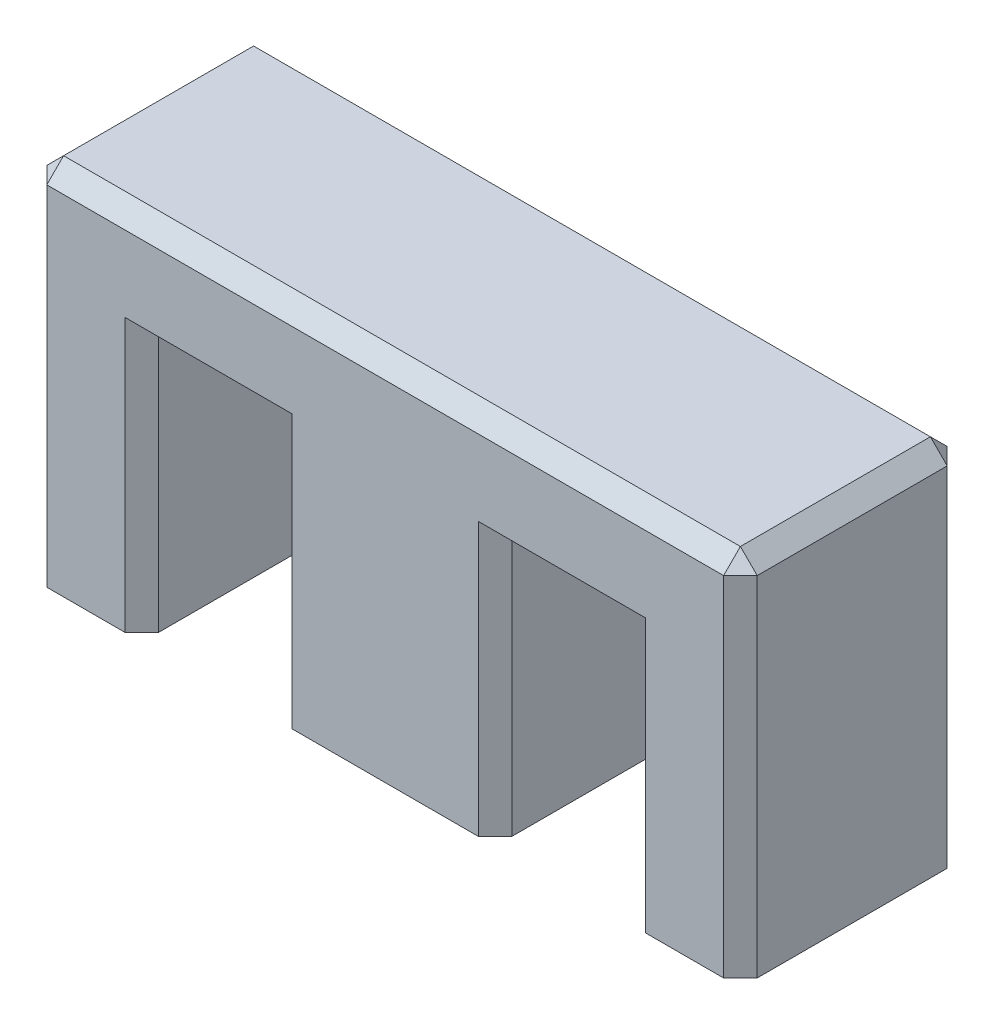
ISO-10303-21;
HEADER;
FILE_DESCRIPTION(('STEP AP214'),'2;1');
FILE_NAME('part.step','',(''),(''),'','','');
FILE_SCHEMA(('AUTOMOTIVE_DESIGN { 1 0 10303 214 1 1 1 1 }'));
ENDSEC;
DATA;
#1=APPLICATION_CONTEXT('core data for automotive mechanical design processes');
#2=APPLICATION_PROTOCOL_DEFINITION('international standard','automotive_design',2000,#1);
#3=PRODUCT_CONTEXT('',#1,'mechanical');
#4=PRODUCT('Part','Part','',(#3));
#5=PRODUCT_RELATED_PRODUCT_CATEGORY('part','',(#4));
#6=PRODUCT_DEFINITION_FORMATION('','',#4);
#7=PRODUCT_DEFINITION_CONTEXT('part definition',#1,'design');
#8=PRODUCT_DEFINITION('design','',#6,#7);
#9=PRODUCT_DEFINITION_SHAPE('','',#8);
#10=(LENGTH_UNIT() NAMED_UNIT(*) SI_UNIT(.MILLI.,.METRE.));
#11=(NAMED_UNIT(*) PLANE_ANGLE_UNIT() SI_UNIT($,.RADIAN.));
#12=(NAMED_UNIT(*) SI_UNIT($,.STERADIAN.) SOLID_ANGLE_UNIT());
#13=UNCERTAINTY_MEASURE_WITH_UNIT(LENGTH_MEASURE(1.E-05),#10,'distance_accuracy_value','');
#14=(GEOMETRIC_REPRESENTATION_CONTEXT(3) GLOBAL_UNCERTAINTY_ASSIGNED_CONTEXT((#13)) GLOBAL_UNIT_ASSIGNED_CONTEXT((#10,
#11,#12)) REPRESENTATION_CONTEXT('',''));
#15=CARTESIAN_POINT('',(0.,0.,0.));
#16=DIRECTION('',(0.,0.,1.));
#17=DIRECTION('',(1.,0.,0.));
#18=AXIS2_PLACEMENT_3D('',#15,#16,#17);
#19=CARTESIAN_POINT('',(28.95,18.0235294117647,13.3));
#20=DIRECTION('',(0.,1.,0.));
#21=DIRECTION('',(-1.,0.,0.));
#22=AXIS2_PLACEMENT_3D('',#19,#20,#21);
#23=PLANE('',#22);
#24=DIRECTION('',(0.,0.,-1.));
#25=VECTOR('',#24,1.);
#26=CARTESIAN_POINT('',(13.075,18.0235294117647,13.3));
#27=LINE('',#26,#25);
#28=CARTESIAN_POINT('',(13.075,18.0235294117647,11.3));
#29=VERTEX_POINT('',#28);
#30=CARTESIAN_POINT('',(13.075,18.0235294117647,-11.3));
#31=VERTEX_POINT('',#30);
#32=EDGE_CURVE('E412',#29,#31,#27,.T.);
#33=ORIENTED_EDGE('',*,*,#32,.T.);
#34=DIRECTION('',(1.,0.,0.));
#35=VECTOR('',#34,1.);
#36=CARTESIAN_POINT('',(28.95,18.0235294117647,-11.3));
#37=LINE('',#36,#35);
#38=CARTESIAN_POINT('',(28.95,18.0235294117647,-11.3));
#39=VERTEX_POINT('',#38);
#40=EDGE_CURVE('E336',#31,#39,#37,.T.);
#41=ORIENTED_EDGE('',*,*,#40,.T.);
#42=DIRECTION('',(0.,0.,-1.));
#43=VECTOR('',#42,1.);
#44=CARTESIAN_POINT('',(28.95,18.0235294117647,13.3));
#45=LINE('',#44,#43);
#46=CARTESIAN_POINT('',(28.95,18.0235294117647,11.3));
#47=VERTEX_POINT('',#46);
#48=EDGE_CURVE('E242',#47,#39,#45,.T.);
#49=ORIENTED_EDGE('',*,*,#48,.F.);
#50=DIRECTION('',(-1.,0.,0.));
#51=VECTOR('',#50,1.);
#52=CARTESIAN_POINT('',(13.075,18.0235294117647,11.3));
#53=LINE('',#52,#51);
#54=EDGE_CURVE('E334',#47,#29,#53,.T.);
#55=ORIENTED_EDGE('',*,*,#54,.T.);
#56=EDGE_LOOP('',(#33,#41,#49,#55));
#57=FACE_BOUND('',#56,.T.);
#58=ADVANCED_FACE('F35',(#57),#23,.F.);
#59=CARTESIAN_POINT('',(28.95,-12.4264705882353,13.3));
#60=DIRECTION('',(1.,0.,0.));
#61=DIRECTION('',(0.,0.,-1.));
#62=AXIS2_PLACEMENT_3D('',#59,#60,#61);
#63=PLANE('',#62);
#64=ORIENTED_EDGE('',*,*,#48,.T.);
#65=DIRECTION('',(0.,-1.,0.));
#66=VECTOR('',#65,1.);
#67=CARTESIAN_POINT('',(28.95,-12.4264705882353,-11.3));
#68=LINE('',#67,#66);
#69=CARTESIAN_POINT('',(28.95,-12.4264705882353,-11.3));
#70=VERTEX_POINT('',#69);
#71=EDGE_CURVE('E332',#39,#70,#68,.T.);
#72=ORIENTED_EDGE('',*,*,#71,.T.);
#73=DIRECTION('',(0.,0.,-1.));
#74=VECTOR('',#73,1.);
#75=CARTESIAN_POINT('',(28.95,-12.4264705882353,13.3));
#76=LINE('',#75,#74);
#77=CARTESIAN_POINT('',(28.95,-12.4264705882353,11.3));
#78=VERTEX_POINT('',#77);
#79=EDGE_CURVE('E447',#78,#70,#76,.T.);
#80=ORIENTED_EDGE('',*,*,#79,.F.);
#81=DIRECTION('',(0.,1.,0.));
#82=VECTOR('',#81,1.);
#83=CARTESIAN_POINT('',(28.95,18.0235294117647,11.3));
#84=LINE('',#83,#82);
#85=EDGE_CURVE('E330',#78,#47,#84,.T.);
#86=ORIENTED_EDGE('',*,*,#85,.T.);
#87=EDGE_LOOP('',(#64,#72,#80,#86));
#88=FACE_BOUND('',#87,.T.);
#89=ADVANCED_FACE('F522',(#88),#63,.F.);
#90=CARTESIAN_POINT('',(42.25,-12.4264705882353,13.3));
#91=DIRECTION('',(0.,1.,0.));
#92=DIRECTION('',(0.,0.,1.));
#93=AXIS2_PLACEMENT_3D('',#90,#91,#92);
#94=PLANE('',#93);
#95=DIRECTION('',(0.,0.,-1.));
#96=VECTOR('',#95,1.);
#97=CARTESIAN_POINT('',(42.25,-12.4264705882353,13.3));
#98=LINE('',#97,#96);
#99=CARTESIAN_POINT('',(42.25,-12.4264705882353,11.3));
#100=VERTEX_POINT('',#99);
#101=CARTESIAN_POINT('',(42.25,-12.4264705882353,-11.3));
#102=VERTEX_POINT('',#101);
#103=EDGE_CURVE('E444',#100,#102,#98,.T.);
#104=ORIENTED_EDGE('',*,*,#103,.F.);
#105=DIRECTION('',(-0.707106781186548,0.,0.707106781186548));
#106=VECTOR('',#105,1.);
#107=CARTESIAN_POINT('',(40.25,-12.4264705882353,13.3));
#108=LINE('',#107,#106);
#109=CARTESIAN_POINT('',(40.25,-12.4264705882353,13.3));
#110=VERTEX_POINT('',#109);
#111=EDGE_CURVE('E283',#100,#110,#108,.T.);
#112=ORIENTED_EDGE('',*,*,#111,.T.);
#113=DIRECTION('',(1.,0.,0.));
#114=VECTOR('',#113,1.);
#115=CARTESIAN_POINT('',(42.25,-12.4264705882353,13.3));
#116=LINE('',#115,#114);
#117=CARTESIAN_POINT('',(30.95,-12.4264705882353,13.3));
#118=VERTEX_POINT('',#117);
#119=EDGE_CURVE('E419',#118,#110,#116,.T.);
#120=ORIENTED_EDGE('',*,*,#119,.F.);
#121=DIRECTION('',(-0.707106781186548,0.,-0.707106781186548));
#122=VECTOR('',#121,1.);
#123=CARTESIAN_POINT('',(30.95,-12.4264705882353,13.3));
#124=LINE('',#123,#122);
#125=EDGE_CURVE('E277',#118,#78,#124,.T.);
#126=ORIENTED_EDGE('',*,*,#125,.T.);
#127=ORIENTED_EDGE('',*,*,#79,.T.);
#128=DIRECTION('',(-0.707106781186548,0.,0.707106781186548));
#129=VECTOR('',#128,1.);
#130=CARTESIAN_POINT('',(28.95,-12.4264705882353,-11.3));
#131=LINE('',#130,#129);
#132=CARTESIAN_POINT('',(30.95,-12.4264705882353,-13.3));
#133=VERTEX_POINT('',#132);
#134=EDGE_CURVE('E279',#70,#133,#131,.F.);
#135=ORIENTED_EDGE('',*,*,#134,.T.);
#136=DIRECTION('',(1.,0.,0.));
#137=VECTOR('',#136,1.);
#138=CARTESIAN_POINT('',(42.25,-12.4264705882353,-13.3));
#139=LINE('',#138,#137);
#140=CARTESIAN_POINT('',(40.25,-12.4264705882353,-13.3));
#141=VERTEX_POINT('',#140);
#142=EDGE_CURVE('E370',#133,#141,#139,.T.);
#143=ORIENTED_EDGE('',*,*,#142,.T.);
#144=DIRECTION('',(-0.707106781186548,0.,-0.707106781186548));
#145=VECTOR('',#144,1.);
#146=CARTESIAN_POINT('',(42.25,-12.4264705882353,-11.3));
#147=LINE('',#146,#145);
#148=EDGE_CURVE('E281',#141,#102,#147,.F.);
#149=ORIENTED_EDGE('',*,*,#148,.T.);
#150=EDGE_LOOP('',(#104,#112,#120,#126,#127,#135,#143,#149));
#151=FACE_BOUND('',#150,.T.);
#152=ADVANCED_FACE('F486',(#151),#94,.F.);
#153=CARTESIAN_POINT('',(42.25,31.0235294117647,13.3));
#154=DIRECTION('',(-1.,0.,0.));
#155=DIRECTION('',(0.,0.,1.));
#156=AXIS2_PLACEMENT_3D('',#153,#154,#155);
#157=PLANE('',#156);
#158=DIRECTION('',(0.,0.,1.));
#159=VECTOR('',#158,1.);
#160=CARTESIAN_POINT('',(42.25,29.0235294117647,13.3));
#161=LINE('',#160,#159);
#162=CARTESIAN_POINT('',(42.25,29.0235294117647,-11.3));
#163=VERTEX_POINT('',#162);
#164=CARTESIAN_POINT('',(42.25,29.0235294117647,11.3));
#165=VERTEX_POINT('',#164);
#166=EDGE_CURVE('E218',#163,#165,#161,.T.);
#167=ORIENTED_EDGE('',*,*,#166,.T.);
#168=DIRECTION('',(0.,-1.,0.));
#169=VECTOR('',#168,1.);
#170=CARTESIAN_POINT('',(42.25,-12.4264705882353,11.3));
#171=LINE('',#170,#169);
#172=EDGE_CURVE('E255',#165,#100,#171,.T.);
#173=ORIENTED_EDGE('',*,*,#172,.T.);
#174=ORIENTED_EDGE('',*,*,#103,.T.);
#175=DIRECTION('',(0.,1.,0.));
#176=VECTOR('',#175,1.);
#177=CARTESIAN_POINT('',(42.25,31.0235294117647,-11.3));
#178=LINE('',#177,#176);
#179=EDGE_CURVE('E248',#102,#163,#178,.T.);
#180=ORIENTED_EDGE('',*,*,#179,.T.);
#181=EDGE_LOOP('',(#167,#173,#174,#180));
#182=FACE_BOUND('',#181,.T.);
#183=ADVANCED_FACE('F474',(#182),#157,.F.);
#184=CARTESIAN_POINT('',(42.25,31.0235294117647,13.3));
#185=DIRECTION('',(0.,-1.,0.));
#186=DIRECTION('',(0.,0.,-1.));
#187=AXIS2_PLACEMENT_3D('',#184,#185,#186);
#188=PLANE('',#187);
#189=DIRECTION('',(1.,0.,0.));
#190=VECTOR('',#189,1.);
#191=CARTESIAN_POINT('',(42.25,31.0235294117647,11.3));
#192=LINE('',#191,#190);
#193=CARTESIAN_POINT('',(-40.25,31.0235294117647,11.3));
#194=VERTEX_POINT('',#193);
#195=CARTESIAN_POINT('',(40.25,31.0235294117647,11.3));
#196=VERTEX_POINT('',#195);
#197=EDGE_CURVE('E246',#194,#196,#192,.T.);
#198=ORIENTED_EDGE('',*,*,#197,.T.);
#199=DIRECTION('',(0.,0.,-1.));
#200=VECTOR('',#199,1.);
#201=CARTESIAN_POINT('',(40.25,31.0235294117647,13.3));
#202=LINE('',#201,#200);
#203=CARTESIAN_POINT('',(40.25,31.0235294117647,-11.3));
#204=VERTEX_POINT('',#203);
#205=EDGE_CURVE('E216',#196,#204,#202,.T.);
#206=ORIENTED_EDGE('',*,*,#205,.T.);
#207=DIRECTION('',(-1.,0.,0.));
#208=VECTOR('',#207,1.);
#209=CARTESIAN_POINT('',(42.25,31.0235294117647,-11.3));
#210=LINE('',#209,#208);
#211=CARTESIAN_POINT('',(-40.25,31.0235294117647,-11.3));
#212=VERTEX_POINT('',#211);
#213=EDGE_CURVE('E235',#204,#212,#210,.T.);
#214=ORIENTED_EDGE('',*,*,#213,.T.);
#215=DIRECTION('',(0.,0.,1.));
#216=VECTOR('',#215,1.);
#217=CARTESIAN_POINT('',(-40.25,31.0235294117647,13.3));
#218=LINE('',#217,#216);
#219=EDGE_CURVE('E241',#212,#194,#218,.T.);
#220=ORIENTED_EDGE('',*,*,#219,.T.);
#221=EDGE_LOOP('',(#198,#206,#214,#220));
#222=FACE_BOUND('',#221,.T.);
#223=ADVANCED_FACE('F244',(#222),#188,.F.);
#224=CARTESIAN_POINT('',(-42.25,31.0235294117647,13.3));
#225=DIRECTION('',(1.,0.,0.));
#226=DIRECTION('',(0.,0.,-1.));
#227=AXIS2_PLACEMENT_3D('',#224,#225,#226);
#228=PLANE('',#227);
#229=DIRECTION('',(0.,0.,-1.));
#230=VECTOR('',#229,1.);
#231=CARTESIAN_POINT('',(-42.25,-12.4264705882353,13.3));
#232=LINE('',#231,#230);
#233=CARTESIAN_POINT('',(-42.25,-12.4264705882353,11.3));
#234=VERTEX_POINT('',#233);
#235=CARTESIAN_POINT('',(-42.25,-12.4264705882353,-11.3));
#236=VERTEX_POINT('',#235);
#237=EDGE_CURVE('E441',#234,#236,#232,.T.);
#238=ORIENTED_EDGE('',*,*,#237,.F.);
#239=DIRECTION('',(0.,1.,0.));
#240=VECTOR('',#239,1.);
#241=CARTESIAN_POINT('',(-42.25,31.0235294117647,11.3));
#242=LINE('',#241,#240);
#243=CARTESIAN_POINT('',(-42.25,29.0235294117647,11.3));
#244=VERTEX_POINT('',#243);
#245=EDGE_CURVE('E297',#234,#244,#242,.T.);
#246=ORIENTED_EDGE('',*,*,#245,.T.);
#247=DIRECTION('',(0.,0.,-1.));
#248=VECTOR('',#247,1.);
#249=CARTESIAN_POINT('',(-42.25,29.0235294117647,13.3));
#250=LINE('',#249,#248);
#251=CARTESIAN_POINT('',(-42.25,29.0235294117647,-11.3));
#252=VERTEX_POINT('',#251);
#253=EDGE_CURVE('E295',#244,#252,#250,.T.);
#254=ORIENTED_EDGE('',*,*,#253,.T.);
#255=DIRECTION('',(0.,-1.,0.));
#256=VECTOR('',#255,1.);
#257=CARTESIAN_POINT('',(-42.25,31.0235294117647,-11.3));
#258=LINE('',#257,#256);
#259=EDGE_CURVE('E293',#252,#236,#258,.T.);
#260=ORIENTED_EDGE('',*,*,#259,.T.);
#261=EDGE_LOOP('',(#238,#246,#254,#260));
#262=FACE_BOUND('',#261,.T.);
#263=ADVANCED_FACE('F803',(#262),#228,.F.);
#264=CARTESIAN_POINT('',(-42.25,-12.4264705882353,13.3));
#265=DIRECTION('',(0.,1.,0.));
#266=DIRECTION('',(0.,0.,1.));
#267=AXIS2_PLACEMENT_3D('',#264,#265,#266);
#268=PLANE('',#267);
#269=DIRECTION('',(1.,0.,0.));
#270=VECTOR('',#269,1.);
#271=CARTESIAN_POINT('',(-42.25,-12.4264705882353,13.3));
#272=LINE('',#271,#270);
#273=CARTESIAN_POINT('',(-40.25,-12.4264705882353,13.3));
#274=VERTEX_POINT('',#273);
#275=CARTESIAN_POINT('',(-30.95,-12.4264705882353,13.3));
#276=VERTEX_POINT('',#275);
#277=EDGE_CURVE('E413',#274,#276,#272,.T.);
#278=ORIENTED_EDGE('',*,*,#277,.F.);
#279=DIRECTION('',(-0.707106781186548,0.,-0.707106781186548));
#280=VECTOR('',#279,1.);
#281=CARTESIAN_POINT('',(-40.25,-12.4264705882353,13.3));
#282=LINE('',#281,#280);
#283=EDGE_CURVE('E291',#274,#234,#282,.T.);
#284=ORIENTED_EDGE('',*,*,#283,.T.);
#285=ORIENTED_EDGE('',*,*,#237,.T.);
#286=DIRECTION('',(-0.707106781186548,0.,0.707106781186548));
#287=VECTOR('',#286,1.);
#288=CARTESIAN_POINT('',(-42.25,-12.4264705882353,-11.3));
#289=LINE('',#288,#287);
#290=CARTESIAN_POINT('',(-40.25,-12.4264705882353,-13.3));
#291=VERTEX_POINT('',#290);
#292=EDGE_CURVE('E289',#236,#291,#289,.F.);
#293=ORIENTED_EDGE('',*,*,#292,.T.);
#294=DIRECTION('',(1.,0.,0.));
#295=VECTOR('',#294,1.);
#296=CARTESIAN_POINT('',(-42.25,-12.4264705882353,-13.3));
#297=LINE('',#296,#295);
#298=CARTESIAN_POINT('',(-30.95,-12.4264705882353,-13.3));
#299=VERTEX_POINT('',#298);
#300=EDGE_CURVE('E425',#291,#299,#297,.T.);
#301=ORIENTED_EDGE('',*,*,#300,.T.);
#302=DIRECTION('',(-0.707106781186548,0.,-0.707106781186548));
#303=VECTOR('',#302,1.);
#304=CARTESIAN_POINT('',(-28.95,-12.4264705882353,-11.3));
#305=LINE('',#304,#303);
#306=CARTESIAN_POINT('',(-28.95,-12.4264705882353,-11.3));
#307=VERTEX_POINT('',#306);
#308=EDGE_CURVE('E287',#299,#307,#305,.F.);
#309=ORIENTED_EDGE('',*,*,#308,.T.);
#310=DIRECTION('',(0.,0.,-1.));
#311=VECTOR('',#310,1.);
#312=CARTESIAN_POINT('',(-28.95,-12.4264705882353,13.3));
#313=LINE('',#312,#311);
#314=CARTESIAN_POINT('',(-28.95,-12.4264705882353,11.3));
#315=VERTEX_POINT('',#314);
#316=EDGE_CURVE('E438',#315,#307,#313,.T.);
#317=ORIENTED_EDGE('',*,*,#316,.F.);
#318=DIRECTION('',(-0.707106781186548,0.,0.707106781186548));
#319=VECTOR('',#318,1.);
#320=CARTESIAN_POINT('',(-30.95,-12.4264705882353,13.3));
#321=LINE('',#320,#319);
#322=EDGE_CURVE('E285',#315,#276,#321,.T.);
#323=ORIENTED_EDGE('',*,*,#322,.T.);
#324=EDGE_LOOP('',(#278,#284,#285,#293,#301,#309,#317,#323));
#325=FACE_BOUND('',#324,.T.);
#326=ADVANCED_FACE('F795',(#325),#268,.F.);
#327=CARTESIAN_POINT('',(-28.95,-12.4264705882353,13.3));
#328=DIRECTION('',(-1.,0.,0.));
#329=DIRECTION('',(0.,0.,1.));
#330=AXIS2_PLACEMENT_3D('',#327,#328,#329);
#331=PLANE('',#330);
#332=ORIENTED_EDGE('',*,*,#316,.T.);
#333=DIRECTION('',(0.,1.,0.));
#334=VECTOR('',#333,1.);
#335=CARTESIAN_POINT('',(-28.95,-12.4264705882353,-11.3));
#336=LINE('',#335,#334);
#337=CARTESIAN_POINT('',(-28.95,18.0235294117647,-11.3));
#338=VERTEX_POINT('',#337);
#339=EDGE_CURVE('E340',#307,#338,#336,.T.);
#340=ORIENTED_EDGE('',*,*,#339,.T.);
#341=DIRECTION('',(0.,0.,-1.));
#342=VECTOR('',#341,1.);
#343=CARTESIAN_POINT('',(-28.95,18.0235294117647,13.3));
#344=LINE('',#343,#342);
#345=CARTESIAN_POINT('',(-28.95,18.0235294117647,11.3));
#346=VERTEX_POINT('',#345);
#347=EDGE_CURVE('E436',#346,#338,#344,.T.);
#348=ORIENTED_EDGE('',*,*,#347,.F.);
#349=DIRECTION('',(0.,-1.,0.));
#350=VECTOR('',#349,1.);
#351=CARTESIAN_POINT('',(-28.95,-12.4264705882353,11.3));
#352=LINE('',#351,#350);
#353=EDGE_CURVE('E338',#346,#315,#352,.T.);
#354=ORIENTED_EDGE('',*,*,#353,.T.);
#355=EDGE_LOOP('',(#332,#340,#348,#354));
#356=FACE_BOUND('',#355,.T.);
#357=ADVANCED_FACE('F788',(#356),#331,.F.);
#358=CARTESIAN_POINT('',(-28.95,18.0235294117647,13.3));
#359=DIRECTION('',(0.,1.,0.));
#360=DIRECTION('',(-1.,0.,0.));
#361=AXIS2_PLACEMENT_3D('',#358,#359,#360);
#362=PLANE('',#361);
#363=ORIENTED_EDGE('',*,*,#347,.T.);
#364=DIRECTION('',(1.,0.,0.));
#365=VECTOR('',#364,1.);
#366=CARTESIAN_POINT('',(-28.95,18.0235294117647,-11.3));
#367=LINE('',#366,#365);
#368=CARTESIAN_POINT('',(-13.075,18.0235294117647,-11.3));
#369=VERTEX_POINT('',#368);
#370=EDGE_CURVE('E11',#338,#369,#367,.T.);
#371=ORIENTED_EDGE('',*,*,#370,.T.);
#372=DIRECTION('',(0.,0.,-1.));
#373=VECTOR('',#372,1.);
#374=CARTESIAN_POINT('',(-13.075,18.0235294117647,13.3));
#375=LINE('',#374,#373);
#376=CARTESIAN_POINT('',(-13.075,18.0235294117647,11.3));
#377=VERTEX_POINT('',#376);
#378=EDGE_CURVE('E434',#377,#369,#375,.T.);
#379=ORIENTED_EDGE('',*,*,#378,.F.);
#380=DIRECTION('',(-1.,0.,0.));
#381=VECTOR('',#380,1.);
#382=CARTESIAN_POINT('',(-28.95,18.0235294117647,11.3));
#383=LINE('',#382,#381);
#384=EDGE_CURVE('E45',#377,#346,#383,.T.);
#385=ORIENTED_EDGE('',*,*,#384,.T.);
#386=EDGE_LOOP('',(#363,#371,#379,#385));
#387=FACE_BOUND('',#386,.T.);
#388=ADVANCED_FACE('F781',(#387),#362,.F.);
#389=CARTESIAN_POINT('',(-13.075,18.0235294117647,13.3));
#390=DIRECTION('',(1.,0.,0.));
#391=DIRECTION('',(0.,1.,0.));
#392=AXIS2_PLACEMENT_3D('',#389,#390,#391);
#393=PLANE('',#392);
#394=ORIENTED_EDGE('',*,*,#378,.T.);
#395=DIRECTION('',(0.,-1.,0.));
#396=VECTOR('',#395,1.);
#397=CARTESIAN_POINT('',(-13.075,18.0235294117647,-11.3));
#398=LINE('',#397,#396);
#399=CARTESIAN_POINT('',(-13.075,-12.4264705882353,-11.3));
#400=VERTEX_POINT('',#399);
#401=EDGE_CURVE('E344',#369,#400,#398,.T.);
#402=ORIENTED_EDGE('',*,*,#401,.T.);
#403=DIRECTION('',(0.,0.,-1.));
#404=VECTOR('',#403,1.);
#405=CARTESIAN_POINT('',(-13.075,-12.4264705882353,13.3));
#406=LINE('',#405,#404);
#407=CARTESIAN_POINT('',(-13.075,-12.4264705882353,11.3));
#408=VERTEX_POINT('',#407);
#409=EDGE_CURVE('E432',#408,#400,#406,.T.);
#410=ORIENTED_EDGE('',*,*,#409,.F.);
#411=DIRECTION('',(0.,1.,0.));
#412=VECTOR('',#411,1.);
#413=CARTESIAN_POINT('',(-13.075,18.0235294117647,11.3));
#414=LINE('',#413,#412);
#415=EDGE_CURVE('E58',#408,#377,#414,.T.);
#416=ORIENTED_EDGE('',*,*,#415,.T.);
#417=EDGE_LOOP('',(#394,#402,#410,#416));
#418=FACE_BOUND('',#417,.T.);
#419=ADVANCED_FACE('F774',(#418),#393,.F.);
#420=CARTESIAN_POINT('',(-13.075,-12.4264705882353,13.3));
#421=DIRECTION('',(0.,1.,0.));
#422=DIRECTION('',(0.,0.,1.));
#423=AXIS2_PLACEMENT_3D('',#420,#421,#422);
#424=PLANE('',#423);
#425=DIRECTION('',(1.,0.,0.));
#426=VECTOR('',#425,1.);
#427=CARTESIAN_POINT('',(-13.075,-12.4264705882353,-13.3));
#428=LINE('',#427,#426);
#429=CARTESIAN_POINT('',(-11.075,-12.4264705882353,-13.3));
#430=VERTEX_POINT('',#429);
#431=CARTESIAN_POINT('',(11.075,-12.4264705882353,-13.3));
#432=VERTEX_POINT('',#431);
#433=EDGE_CURVE('E428',#430,#432,#428,.T.);
#434=ORIENTED_EDGE('',*,*,#433,.T.);
#435=DIRECTION('',(-0.707106781186547,0.,-0.707106781186548));
#436=VECTOR('',#435,1.);
#437=CARTESIAN_POINT('',(13.075,-12.4264705882353,-11.3));
#438=LINE('',#437,#436);
#439=CARTESIAN_POINT('',(13.075,-12.4264705882353,-11.3));
#440=VERTEX_POINT('',#439);
#441=EDGE_CURVE('E328',#432,#440,#438,.F.);
#442=ORIENTED_EDGE('',*,*,#441,.T.);
#443=DIRECTION('',(0.,0.,-1.));
#444=VECTOR('',#443,1.);
#445=CARTESIAN_POINT('',(13.075,-12.4264705882353,13.3));
#446=LINE('',#445,#444);
#447=CARTESIAN_POINT('',(13.075,-12.4264705882353,11.3));
#448=VERTEX_POINT('',#447);
#449=EDGE_CURVE('E416',#448,#440,#446,.T.);
#450=ORIENTED_EDGE('',*,*,#449,.F.);
#451=DIRECTION('',(-0.707106781186547,0.,0.707106781186548));
#452=VECTOR('',#451,1.);
#453=CARTESIAN_POINT('',(11.075,-12.4264705882353,13.3));
#454=LINE('',#453,#452);
#455=CARTESIAN_POINT('',(11.075,-12.4264705882353,13.3));
#456=VERTEX_POINT('',#455);
#457=EDGE_CURVE('E324',#448,#456,#454,.T.);
#458=ORIENTED_EDGE('',*,*,#457,.T.);
#459=DIRECTION('',(1.,0.,0.));
#460=VECTOR('',#459,1.);
#461=CARTESIAN_POINT('',(-13.075,-12.4264705882353,13.3));
#462=LINE('',#461,#460);
#463=CARTESIAN_POINT('',(-11.075,-12.4264705882353,13.3));
#464=VERTEX_POINT('',#463);
#465=EDGE_CURVE('E404',#464,#456,#462,.T.);
#466=ORIENTED_EDGE('',*,*,#465,.F.);
#467=DIRECTION('',(-0.707106781186547,0.,-0.707106781186548));
#468=VECTOR('',#467,1.);
#469=CARTESIAN_POINT('',(-11.075,-12.4264705882353,13.3));
#470=LINE('',#469,#468);
#471=EDGE_CURVE('E322',#464,#408,#470,.T.);
#472=ORIENTED_EDGE('',*,*,#471,.T.);
#473=ORIENTED_EDGE('',*,*,#409,.T.);
#474=DIRECTION('',(-0.707106781186547,0.,0.707106781186548));
#475=VECTOR('',#474,1.);
#476=CARTESIAN_POINT('',(-13.075,-12.4264705882353,-11.3));
#477=LINE('',#476,#475);
#478=EDGE_CURVE('E326',#400,#430,#477,.F.);
#479=ORIENTED_EDGE('',*,*,#478,.T.);
#480=EDGE_LOOP('',(#434,#442,#450,#458,#466,#472,#473,#479));
#481=FACE_BOUND('',#480,.T.);
#482=ADVANCED_FACE('F408',(#481),#424,.F.);
#483=CARTESIAN_POINT('',(13.075,18.0235294117647,13.3));
#484=DIRECTION('',(-1.,0.,0.));
#485=DIRECTION('',(0.,-1.,0.));
#486=AXIS2_PLACEMENT_3D('',#483,#484,#485);
#487=PLANE('',#486);
#488=ORIENTED_EDGE('',*,*,#449,.T.);
#489=DIRECTION('',(0.,1.,0.));
#490=VECTOR('',#489,1.);
#491=CARTESIAN_POINT('',(13.075,18.0235294117647,-11.3));
#492=LINE('',#491,#490);
#493=EDGE_CURVE('E319',#440,#31,#492,.T.);
#494=ORIENTED_EDGE('',*,*,#493,.T.);
#495=ORIENTED_EDGE('',*,*,#32,.F.);
#496=DIRECTION('',(0.,-1.,0.));
#497=VECTOR('',#496,1.);
#498=CARTESIAN_POINT('',(13.075,-12.4264705882353,11.3));
#499=LINE('',#498,#497);
#500=EDGE_CURVE('E317',#29,#448,#499,.T.);
#501=ORIENTED_EDGE('',*,*,#500,.T.);
#502=EDGE_LOOP('',(#488,#494,#495,#501));
#503=FACE_BOUND('',#502,.T.);
#504=ADVANCED_FACE('F508',(#503),#487,.F.);
#505=CARTESIAN_POINT('',(0.,0.,13.3));
#506=DIRECTION('',(0.,0.,1.));
#507=DIRECTION('',(1.,0.,0.));
#508=AXIS2_PLACEMENT_3D('',#505,#506,#507);
#509=PLANE('',#508);
#510=ORIENTED_EDGE('',*,*,#119,.T.);
#511=DIRECTION('',(0.,1.,0.));
#512=VECTOR('',#511,1.);
#513=CARTESIAN_POINT('',(40.25,31.0235294117647,13.3));
#514=LINE('',#513,#512);
#515=CARTESIAN_POINT('',(40.25,29.0235294117647,13.3));
#516=VERTEX_POINT('',#515);
#517=EDGE_CURVE('E275',#110,#516,#514,.T.);
#518=ORIENTED_EDGE('',*,*,#517,.T.);
#519=DIRECTION('',(-1.,0.,0.));
#520=VECTOR('',#519,1.);
#521=CARTESIAN_POINT('',(-42.25,29.0235294117647,13.3));
#522=LINE('',#521,#520);
#523=CARTESIAN_POINT('',(-40.25,29.0235294117647,13.3));
#524=VERTEX_POINT('',#523);
#525=EDGE_CURVE('E273',#516,#524,#522,.T.);
#526=ORIENTED_EDGE('',*,*,#525,.T.);
#527=DIRECTION('',(0.,-1.,0.));
#528=VECTOR('',#527,1.);
#529=CARTESIAN_POINT('',(-40.25,-12.4264705882353,13.3));
#530=LINE('',#529,#528);
#531=EDGE_CURVE('E271',#524,#274,#530,.T.);
#532=ORIENTED_EDGE('',*,*,#531,.T.);
#533=ORIENTED_EDGE('',*,*,#277,.T.);
#534=DIRECTION('',(0.,1.,0.));
#535=VECTOR('',#534,1.);
#536=CARTESIAN_POINT('',(-30.95,18.0235294117647,13.3));
#537=LINE('',#536,#535);
#538=CARTESIAN_POINT('',(-30.95,20.0235294117647,13.3));
#539=VERTEX_POINT('',#538);
#540=EDGE_CURVE('E261',#276,#539,#537,.T.);
#541=ORIENTED_EDGE('',*,*,#540,.T.);
#542=DIRECTION('',(1.,0.,0.));
#543=VECTOR('',#542,1.);
#544=CARTESIAN_POINT('',(-13.075,20.0235294117647,13.3));
#545=LINE('',#544,#543);
#546=CARTESIAN_POINT('',(-11.075,20.0235294117647,13.3));
#547=VERTEX_POINT('',#546);
#548=EDGE_CURVE('E257',#539,#547,#545,.T.);
#549=ORIENTED_EDGE('',*,*,#548,.T.);
#550=DIRECTION('',(0.,-1.,0.));
#551=VECTOR('',#550,1.);
#552=CARTESIAN_POINT('',(-11.075,-12.4264705882353,13.3));
#553=LINE('',#552,#551);
#554=EDGE_CURVE('E259',#547,#464,#553,.T.);
#555=ORIENTED_EDGE('',*,*,#554,.T.);
#556=ORIENTED_EDGE('',*,*,#465,.T.);
#557=DIRECTION('',(0.,1.,0.));
#558=VECTOR('',#557,1.);
#559=CARTESIAN_POINT('',(11.075,18.0235294117647,13.3));
#560=LINE('',#559,#558);
#561=CARTESIAN_POINT('',(11.075,20.0235294117647,13.3));
#562=VERTEX_POINT('',#561);
#563=EDGE_CURVE('E266',#456,#562,#560,.T.);
#564=ORIENTED_EDGE('',*,*,#563,.T.);
#565=DIRECTION('',(1.,0.,0.));
#566=VECTOR('',#565,1.);
#567=CARTESIAN_POINT('',(28.95,20.0235294117647,13.3));
#568=LINE('',#567,#566);
#569=CARTESIAN_POINT('',(30.95,20.0235294117647,13.3));
#570=VERTEX_POINT('',#569);
#571=EDGE_CURVE('E264',#562,#570,#568,.T.);
#572=ORIENTED_EDGE('',*,*,#571,.T.);
#573=DIRECTION('',(0.,-1.,0.));
#574=VECTOR('',#573,1.);
#575=CARTESIAN_POINT('',(30.95,-12.4264705882353,13.3));
#576=LINE('',#575,#574);
#577=EDGE_CURVE('E268',#570,#118,#576,.T.);
#578=ORIENTED_EDGE('',*,*,#577,.T.);
#579=EDGE_LOOP('',(#510,#518,#526,#532,#533,#541,#549,#555,#556,#564,#572,#578));
#580=FACE_BOUND('',#579,.T.);
#581=ADVANCED_FACE('F403',(#580),#509,.T.);
#582=CARTESIAN_POINT('',(0.,0.,-13.3));
#583=DIRECTION('',(0.,0.,1.));
#584=DIRECTION('',(1.,0.,0.));
#585=AXIS2_PLACEMENT_3D('',#582,#583,#584);
#586=PLANE('',#585);
#587=ORIENTED_EDGE('',*,*,#300,.F.);
#588=DIRECTION('',(0.,1.,0.));
#589=VECTOR('',#588,1.);
#590=CARTESIAN_POINT('',(-40.25,0.,-13.3));
#591=LINE('',#590,#589);
#592=CARTESIAN_POINT('',(-40.25,29.0235294117647,-13.3));
#593=VERTEX_POINT('',#592);
#594=EDGE_CURVE('E315',#291,#593,#591,.T.);
#595=ORIENTED_EDGE('',*,*,#594,.T.);
#596=DIRECTION('',(1.,0.,0.));
#597=VECTOR('',#596,1.);
#598=CARTESIAN_POINT('',(0.,29.0235294117647,-13.3));
#599=LINE('',#598,#597);
#600=CARTESIAN_POINT('',(40.25,29.0235294117647,-13.3));
#601=VERTEX_POINT('',#600);
#602=EDGE_CURVE('E313',#593,#601,#599,.T.);
#603=ORIENTED_EDGE('',*,*,#602,.T.);
#604=DIRECTION('',(0.,-1.,0.));
#605=VECTOR('',#604,1.);
#606=CARTESIAN_POINT('',(40.25,0.,-13.3));
#607=LINE('',#606,#605);
#608=EDGE_CURVE('E311',#601,#141,#607,.T.);
#609=ORIENTED_EDGE('',*,*,#608,.T.);
#610=ORIENTED_EDGE('',*,*,#142,.F.);
#611=DIRECTION('',(0.,1.,0.));
#612=VECTOR('',#611,1.);
#613=CARTESIAN_POINT('',(30.95,0.,-13.3));
#614=LINE('',#613,#612);
#615=CARTESIAN_POINT('',(30.95,20.0235294117647,-13.3));
#616=VERTEX_POINT('',#615);
#617=EDGE_CURVE('E307',#133,#616,#614,.T.);
#618=ORIENTED_EDGE('',*,*,#617,.T.);
#619=DIRECTION('',(-1.,0.,0.));
#620=VECTOR('',#619,1.);
#621=CARTESIAN_POINT('',(0.,20.0235294117647,-13.3));
#622=LINE('',#621,#620);
#623=CARTESIAN_POINT('',(11.075,20.0235294117647,-13.3));
#624=VERTEX_POINT('',#623);
#625=EDGE_CURVE('E305',#616,#624,#622,.T.);
#626=ORIENTED_EDGE('',*,*,#625,.T.);
#627=DIRECTION('',(0.,-1.,0.));
#628=VECTOR('',#627,1.);
#629=CARTESIAN_POINT('',(11.075,0.,-13.3));
#630=LINE('',#629,#628);
#631=EDGE_CURVE('E309',#624,#432,#630,.T.);
#632=ORIENTED_EDGE('',*,*,#631,.T.);
#633=ORIENTED_EDGE('',*,*,#433,.F.);
#634=DIRECTION('',(0.,1.,0.));
#635=VECTOR('',#634,1.);
#636=CARTESIAN_POINT('',(-11.075,0.,-13.3));
#637=LINE('',#636,#635);
#638=CARTESIAN_POINT('',(-11.075,20.0235294117647,-13.3));
#639=VERTEX_POINT('',#638);
#640=EDGE_CURVE('E301',#430,#639,#637,.T.);
#641=ORIENTED_EDGE('',*,*,#640,.T.);
#642=DIRECTION('',(-1.,0.,0.));
#643=VECTOR('',#642,1.);
#644=CARTESIAN_POINT('',(0.,20.0235294117647,-13.3));
#645=LINE('',#644,#643);
#646=CARTESIAN_POINT('',(-30.95,20.0235294117647,-13.3));
#647=VERTEX_POINT('',#646);
#648=EDGE_CURVE('E299',#639,#647,#645,.T.);
#649=ORIENTED_EDGE('',*,*,#648,.T.);
#650=DIRECTION('',(0.,-1.,0.));
#651=VECTOR('',#650,1.);
#652=CARTESIAN_POINT('',(-30.95,0.,-13.3));
#653=LINE('',#652,#651);
#654=EDGE_CURVE('E303',#647,#299,#653,.T.);
#655=ORIENTED_EDGE('',*,*,#654,.T.);
#656=EDGE_LOOP('',(#587,#595,#603,#609,#610,#618,#626,#632,#633,#641,#649,#655));
#657=FACE_BOUND('',#656,.T.);
#658=ADVANCED_FACE('F483',(#657),#586,.F.);
#659=CARTESIAN_POINT('',(-40.25,0.,13.3));
#660=DIRECTION('',(-0.707106781186547,0.,0.707106781186547));
#661=DIRECTION('',(0.,1.,0.));
#662=AXIS2_PLACEMENT_3D('',#659,#660,#661);
#663=PLANE('',#662);
#664=ORIENTED_EDGE('',*,*,#283,.F.);
#665=ORIENTED_EDGE('',*,*,#531,.F.);
#666=DIRECTION('',(0.707106781186547,0.,0.707106781186547));
#667=VECTOR('',#666,1.);
#668=CARTESIAN_POINT('',(-40.25,29.0235294117647,13.3));
#669=LINE('',#668,#667);
#670=EDGE_CURVE('E367',#244,#524,#669,.T.);
#671=ORIENTED_EDGE('',*,*,#670,.F.);
#672=ORIENTED_EDGE('',*,*,#245,.F.);
#673=EDGE_LOOP('',(#664,#665,#671,#672));
#674=FACE_BOUND('',#673,.T.);
#675=ADVANCED_FACE('F594',(#674),#663,.T.);
#676=CARTESIAN_POINT('',(-42.25,29.0235294117647,13.3));
#677=DIRECTION('',(0.707106781186547,-0.707106781186547,0.));
#678=DIRECTION('',(0.,0.,-1.));
#679=AXIS2_PLACEMENT_3D('',#676,#677,#678);
#680=PLANE('',#679);
#681=DIRECTION('',(-0.707106781186547,-0.707106781186547,0.));
#682=VECTOR('',#681,1.);
#683=CARTESIAN_POINT('',(-42.25,29.0235294117647,-11.3));
#684=LINE('',#683,#682);
#685=EDGE_CURVE('E361',#252,#212,#684,.F.);
#686=ORIENTED_EDGE('',*,*,#685,.F.);
#687=ORIENTED_EDGE('',*,*,#253,.F.);
#688=DIRECTION('',(0.707106781186547,0.707106781186547,0.));
#689=VECTOR('',#688,1.);
#690=CARTESIAN_POINT('',(-41.25,30.0235294117647,11.3));
#691=LINE('',#690,#689);
#692=EDGE_CURVE('E364',#194,#244,#691,.F.);
#693=ORIENTED_EDGE('',*,*,#692,.F.);
#694=ORIENTED_EDGE('',*,*,#219,.F.);
#695=EDGE_LOOP('',(#686,#687,#693,#694));
#696=FACE_BOUND('',#695,.T.);
#697=ADVANCED_FACE('F456',(#696),#680,.F.);
#698=CARTESIAN_POINT('',(-42.25,31.0235294117647,-11.3));
#699=DIRECTION('',(0.707106781186547,0.,0.707106781186547));
#700=DIRECTION('',(0.,-1.,0.));
#701=AXIS2_PLACEMENT_3D('',#698,#699,#700);
#702=PLANE('',#701);
#703=ORIENTED_EDGE('',*,*,#292,.F.);
#704=ORIENTED_EDGE('',*,*,#259,.F.);
#705=DIRECTION('',(0.707106781186547,0.,-0.707106781186547));
#706=VECTOR('',#705,1.);
#707=CARTESIAN_POINT('',(-42.25,29.0235294117647,-11.3));
#708=LINE('',#707,#706);
#709=EDGE_CURVE('E358',#593,#252,#708,.F.);
#710=ORIENTED_EDGE('',*,*,#709,.F.);
#711=ORIENTED_EDGE('',*,*,#594,.F.);
#712=EDGE_LOOP('',(#703,#704,#710,#711));
#713=FACE_BOUND('',#712,.T.);
#714=ADVANCED_FACE('F582',(#713),#702,.F.);
#715=CARTESIAN_POINT('',(-40.25,29.0235294117647,13.3));
#716=DIRECTION('',(-0.577350269189626,0.577350269189626,0.577350269189626));
#717=DIRECTION('',(0.707106781186547,0.,0.707106781186547));
#718=AXIS2_PLACEMENT_3D('',#715,#716,#717);
#719=PLANE('',#718);
#720=ORIENTED_EDGE('',*,*,#692,.T.);
#721=ORIENTED_EDGE('',*,*,#670,.T.);
#722=DIRECTION('',(0.,0.707106781186547,-0.707106781186547));
#723=VECTOR('',#722,1.);
#724=CARTESIAN_POINT('',(-40.25,29.0235294117647,13.3));
#725=LINE('',#724,#723);
#726=EDGE_CURVE('E355',#194,#524,#725,.F.);
#727=ORIENTED_EDGE('',*,*,#726,.F.);
#728=EDGE_LOOP('',(#720,#721,#727));
#729=FACE_BOUND('',#728,.T.);
#730=ADVANCED_FACE('F459',(#729),#719,.T.);
#731=CARTESIAN_POINT('',(-42.25,29.0235294117647,-11.3));
#732=DIRECTION('',(-0.577350269189626,0.577350269189626,-0.577350269189626));
#733=DIRECTION('',(-0.707106781186547,0.,0.707106781186547));
#734=AXIS2_PLACEMENT_3D('',#731,#732,#733);
#735=PLANE('',#734);
#736=ORIENTED_EDGE('',*,*,#709,.T.);
#737=ORIENTED_EDGE('',*,*,#685,.T.);
#738=DIRECTION('',(0.,0.707106781186547,0.707106781186547));
#739=VECTOR('',#738,1.);
#740=CARTESIAN_POINT('',(-40.25,30.0235294117647,-12.3));
#741=LINE('',#740,#739);
#742=EDGE_CURVE('E238',#593,#212,#741,.T.);
#743=ORIENTED_EDGE('',*,*,#742,.F.);
#744=EDGE_LOOP('',(#736,#737,#743));
#745=FACE_BOUND('',#744,.T.);
#746=ADVANCED_FACE('F570',(#745),#735,.T.);
#747=CARTESIAN_POINT('',(40.25,0.,13.3));
#748=DIRECTION('',(0.707106781186547,0.,0.707106781186547));
#749=DIRECTION('',(0.,-1.,0.));
#750=AXIS2_PLACEMENT_3D('',#747,#748,#749);
#751=PLANE('',#750);
#752=ORIENTED_EDGE('',*,*,#111,.F.);
#753=ORIENTED_EDGE('',*,*,#172,.F.);
#754=DIRECTION('',(0.707106781186547,0.,-0.707106781186547));
#755=VECTOR('',#754,1.);
#756=CARTESIAN_POINT('',(42.25,29.0235294117647,11.3));
#757=LINE('',#756,#755);
#758=EDGE_CURVE('E351',#516,#165,#757,.T.);
#759=ORIENTED_EDGE('',*,*,#758,.F.);
#760=ORIENTED_EDGE('',*,*,#517,.F.);
#761=EDGE_LOOP('',(#752,#753,#759,#760));
#762=FACE_BOUND('',#761,.T.);
#763=ADVANCED_FACE('F471',(#762),#751,.T.);
#764=CARTESIAN_POINT('',(0.,29.0235294117647,13.3));
#765=DIRECTION('',(0.,0.707106781186547,0.707106781186547));
#766=DIRECTION('',(1.,0.,0.));
#767=AXIS2_PLACEMENT_3D('',#764,#765,#766);
#768=PLANE('',#767);
#769=ORIENTED_EDGE('',*,*,#726,.T.);
#770=ORIENTED_EDGE('',*,*,#525,.F.);
#771=DIRECTION('',(0.,-0.707106781186547,0.707106781186547));
#772=VECTOR('',#771,1.);
#773=CARTESIAN_POINT('',(40.25,30.0235294117647,12.3));
#774=LINE('',#773,#772);
#775=EDGE_CURVE('E232',#196,#516,#774,.T.);
#776=ORIENTED_EDGE('',*,*,#775,.F.);
#777=ORIENTED_EDGE('',*,*,#197,.F.);
#778=EDGE_LOOP('',(#769,#770,#776,#777));
#779=FACE_BOUND('',#778,.T.);
#780=ADVANCED_FACE('F462',(#779),#768,.T.);
#781=CARTESIAN_POINT('',(42.25,31.0235294117647,-11.3));
#782=DIRECTION('',(0.,-0.707106781186547,0.707106781186547));
#783=DIRECTION('',(-1.,0.,0.));
#784=AXIS2_PLACEMENT_3D('',#781,#782,#783);
#785=PLANE('',#784);
#786=ORIENTED_EDGE('',*,*,#742,.T.);
#787=ORIENTED_EDGE('',*,*,#213,.F.);
#788=DIRECTION('',(0.,-0.707106781186547,-0.707106781186547));
#789=VECTOR('',#788,1.);
#790=CARTESIAN_POINT('',(40.25,31.0235294117647,-11.3));
#791=LINE('',#790,#789);
#792=EDGE_CURVE('E225',#601,#204,#791,.F.);
#793=ORIENTED_EDGE('',*,*,#792,.F.);
#794=ORIENTED_EDGE('',*,*,#602,.F.);
#795=EDGE_LOOP('',(#786,#787,#793,#794));
#796=FACE_BOUND('',#795,.T.);
#797=ADVANCED_FACE('F236',(#796),#785,.F.);
#798=CARTESIAN_POINT('',(42.25,31.0235294117647,-11.3));
#799=DIRECTION('',(-0.707106781186547,0.,0.707106781186547));
#800=DIRECTION('',(0.,1.,0.));
#801=AXIS2_PLACEMENT_3D('',#798,#799,#800);
#802=PLANE('',#801);
#803=ORIENTED_EDGE('',*,*,#148,.F.);
#804=ORIENTED_EDGE('',*,*,#608,.F.);
#805=DIRECTION('',(0.707106781186547,0.,0.707106781186547));
#806=VECTOR('',#805,1.);
#807=CARTESIAN_POINT('',(41.25,29.0235294117647,-12.3));
#808=LINE('',#807,#806);
#809=EDGE_CURVE('E229',#163,#601,#808,.F.);
#810=ORIENTED_EDGE('',*,*,#809,.F.);
#811=ORIENTED_EDGE('',*,*,#179,.F.);
#812=EDGE_LOOP('',(#803,#804,#810,#811));
#813=FACE_BOUND('',#812,.T.);
#814=ADVANCED_FACE('F479',(#813),#802,.F.);
#815=CARTESIAN_POINT('',(42.25,29.0235294117647,11.3));
#816=DIRECTION('',(0.577350269189626,0.577350269189626,0.577350269189626));
#817=DIRECTION('',(0.707106781186547,0.,-0.707106781186547));
#818=AXIS2_PLACEMENT_3D('',#815,#816,#817);
#819=PLANE('',#818);
#820=ORIENTED_EDGE('',*,*,#775,.T.);
#821=ORIENTED_EDGE('',*,*,#758,.T.);
#822=DIRECTION('',(0.707106781186547,-0.707106781186547,0.));
#823=VECTOR('',#822,1.);
#824=CARTESIAN_POINT('',(42.25,29.0235294117647,11.3));
#825=LINE('',#824,#823);
#826=EDGE_CURVE('E221',#196,#165,#825,.T.);
#827=ORIENTED_EDGE('',*,*,#826,.F.);
#828=EDGE_LOOP('',(#820,#821,#827));
#829=FACE_BOUND('',#828,.T.);
#830=ADVANCED_FACE('F466',(#829),#819,.T.);
#831=CARTESIAN_POINT('',(40.25,31.0235294117647,-11.3));
#832=DIRECTION('',(0.577350269189626,0.577350269189626,-0.577350269189626));
#833=DIRECTION('',(-0.707106781186547,0.,-0.707106781186547));
#834=AXIS2_PLACEMENT_3D('',#831,#832,#833);
#835=PLANE('',#834);
#836=ORIENTED_EDGE('',*,*,#809,.T.);
#837=ORIENTED_EDGE('',*,*,#792,.T.);
#838=DIRECTION('',(-0.707106781186547,0.707106781186547,0.));
#839=VECTOR('',#838,1.);
#840=CARTESIAN_POINT('',(40.25,31.0235294117647,-11.3));
#841=LINE('',#840,#839);
#842=EDGE_CURVE('E212',#163,#204,#841,.T.);
#843=ORIENTED_EDGE('',*,*,#842,.F.);
#844=EDGE_LOOP('',(#836,#837,#843));
#845=FACE_BOUND('',#844,.T.);
#846=ADVANCED_FACE('F227',(#845),#835,.T.);
#847=CARTESIAN_POINT('',(40.25,31.0235294117647,13.3));
#848=DIRECTION('',(-0.707106781186547,-0.707106781186547,0.));
#849=DIRECTION('',(0.,0.,-1.));
#850=AXIS2_PLACEMENT_3D('',#847,#848,#849);
#851=PLANE('',#850);
#852=ORIENTED_EDGE('',*,*,#826,.T.);
#853=ORIENTED_EDGE('',*,*,#166,.F.);
#854=ORIENTED_EDGE('',*,*,#842,.T.);
#855=ORIENTED_EDGE('',*,*,#205,.F.);
#856=EDGE_LOOP('',(#852,#853,#854,#855));
#857=FACE_BOUND('',#856,.T.);
#858=ADVANCED_FACE('F214',(#857),#851,.F.);
#859=CARTESIAN_POINT('',(28.95,-12.4264705882353,-11.3));
#860=DIRECTION('',(0.707106781186547,0.,0.707106781186547));
#861=DIRECTION('',(0.,-1.,0.));
#862=AXIS2_PLACEMENT_3D('',#859,#860,#861);
#863=PLANE('',#862);
#864=ORIENTED_EDGE('',*,*,#134,.F.);
#865=ORIENTED_EDGE('',*,*,#71,.F.);
#866=DIRECTION('',(-0.577350269189626,-0.577350269189626,0.577350269189626));
#867=VECTOR('',#866,1.);
#868=CARTESIAN_POINT('',(18.8,7.87352941176471,-1.15));
#869=LINE('',#868,#867);
#870=EDGE_CURVE('E222',#616,#39,#869,.T.);
#871=ORIENTED_EDGE('',*,*,#870,.F.);
#872=ORIENTED_EDGE('',*,*,#617,.F.);
#873=EDGE_LOOP('',(#864,#865,#871,#872));
#874=FACE_BOUND('',#873,.T.);
#875=ADVANCED_FACE('F491',(#874),#863,.F.);
#876=CARTESIAN_POINT('',(28.95,18.0235294117647,-11.3));
#877=DIRECTION('',(0.,0.707106781186548,0.707106781186547));
#878=DIRECTION('',(1.,0.,0.));
#879=AXIS2_PLACEMENT_3D('',#876,#877,#878);
#880=PLANE('',#879);
#881=ORIENTED_EDGE('',*,*,#870,.T.);
#882=ORIENTED_EDGE('',*,*,#40,.F.);
#883=DIRECTION('',(-0.577350269189626,0.577350269189626,-0.577350269189626));
#884=VECTOR('',#883,1.);
#885=CARTESIAN_POINT('',(13.075,18.0235294117647,-11.3));
#886=LINE('',#885,#884);
#887=EDGE_CURVE('E371',#624,#31,#886,.F.);
#888=ORIENTED_EDGE('',*,*,#887,.F.);
#889=ORIENTED_EDGE('',*,*,#625,.F.);
#890=EDGE_LOOP('',(#881,#882,#888,#889));
#891=FACE_BOUND('',#890,.T.);
#892=ADVANCED_FACE('F503',(#891),#880,.F.);
#893=CARTESIAN_POINT('',(13.075,18.0235294117647,-11.3));
#894=DIRECTION('',(-0.707106781186548,0.,0.707106781186547));
#895=DIRECTION('',(0.,1.,0.));
#896=AXIS2_PLACEMENT_3D('',#893,#894,#895);
#897=PLANE('',#896);
#898=ORIENTED_EDGE('',*,*,#441,.F.);
#899=ORIENTED_EDGE('',*,*,#631,.F.);
#900=ORIENTED_EDGE('',*,*,#887,.T.);
#901=ORIENTED_EDGE('',*,*,#493,.F.);
#902=EDGE_LOOP('',(#898,#899,#900,#901));
#903=FACE_BOUND('',#902,.T.);
#904=ADVANCED_FACE('F500',(#903),#897,.F.);
#905=CARTESIAN_POINT('',(-13.075,18.0235294117647,-11.3));
#906=DIRECTION('',(0.707106781186548,0.,0.707106781186547));
#907=DIRECTION('',(0.,-1.,0.));
#908=AXIS2_PLACEMENT_3D('',#905,#906,#907);
#909=PLANE('',#908);
#910=ORIENTED_EDGE('',*,*,#478,.F.);
#911=ORIENTED_EDGE('',*,*,#401,.F.);
#912=DIRECTION('',(-0.577350269189626,-0.577350269189626,0.577350269189626));
#913=VECTOR('',#912,1.);
#914=CARTESIAN_POINT('',(-13.075,18.0235294117647,-11.3));
#915=LINE('',#914,#913);
#916=EDGE_CURVE('E373',#639,#369,#915,.T.);
#917=ORIENTED_EDGE('',*,*,#916,.F.);
#918=ORIENTED_EDGE('',*,*,#640,.F.);
#919=EDGE_LOOP('',(#910,#911,#917,#918));
#920=FACE_BOUND('',#919,.T.);
#921=ADVANCED_FACE('F607',(#920),#909,.F.);
#922=CARTESIAN_POINT('',(-28.95,18.0235294117647,-11.3));
#923=DIRECTION('',(0.,0.707106781186548,0.707106781186547));
#924=DIRECTION('',(1.,0.,0.));
#925=AXIS2_PLACEMENT_3D('',#922,#923,#924);
#926=PLANE('',#925);
#927=ORIENTED_EDGE('',*,*,#916,.T.);
#928=ORIENTED_EDGE('',*,*,#370,.F.);
#929=DIRECTION('',(-0.577350269189626,0.577350269189626,-0.577350269189626));
#930=VECTOR('',#929,1.);
#931=CARTESIAN_POINT('',(-18.8,7.87352941176471,-1.15));
#932=LINE('',#931,#930);
#933=EDGE_CURVE('E376',#647,#338,#932,.F.);
#934=ORIENTED_EDGE('',*,*,#933,.F.);
#935=ORIENTED_EDGE('',*,*,#648,.F.);
#936=EDGE_LOOP('',(#927,#928,#934,#935));
#937=FACE_BOUND('',#936,.T.);
#938=ADVANCED_FACE('F625',(#937),#926,.F.);
#939=CARTESIAN_POINT('',(-28.95,-12.4264705882353,-11.3));
#940=DIRECTION('',(-0.707106781186547,0.,0.707106781186547));
#941=DIRECTION('',(0.,1.,0.));
#942=AXIS2_PLACEMENT_3D('',#939,#940,#941);
#943=PLANE('',#942);
#944=ORIENTED_EDGE('',*,*,#308,.F.);
#945=ORIENTED_EDGE('',*,*,#654,.F.);
#946=ORIENTED_EDGE('',*,*,#933,.T.);
#947=ORIENTED_EDGE('',*,*,#339,.F.);
#948=EDGE_LOOP('',(#944,#945,#946,#947));
#949=FACE_BOUND('',#948,.T.);
#950=ADVANCED_FACE('F617',(#949),#943,.F.);
#951=CARTESIAN_POINT('',(11.075,0.,13.3));
#952=DIRECTION('',(0.707106781186548,0.,0.707106781186547));
#953=DIRECTION('',(0.,-1.,0.));
#954=AXIS2_PLACEMENT_3D('',#951,#952,#953);
#955=PLANE('',#954);
#956=ORIENTED_EDGE('',*,*,#457,.F.);
#957=ORIENTED_EDGE('',*,*,#500,.F.);
#958=DIRECTION('',(0.577350269189626,-0.577350269189626,-0.577350269189626));
#959=VECTOR('',#958,1.);
#960=CARTESIAN_POINT('',(17.7495098039216,13.3490196078431,6.62549019607843));
#961=LINE('',#960,#959);
#962=EDGE_CURVE('E378',#562,#29,#961,.T.);
#963=ORIENTED_EDGE('',*,*,#962,.F.);
#964=ORIENTED_EDGE('',*,*,#563,.F.);
#965=EDGE_LOOP('',(#956,#957,#963,#964));
#966=FACE_BOUND('',#965,.T.);
#967=ADVANCED_FACE('F624',(#966),#955,.T.);
#968=CARTESIAN_POINT('',(0.,20.0235294117647,13.3));
#969=DIRECTION('',(0.,-0.707106781186548,0.707106781186547));
#970=DIRECTION('',(-1.,0.,0.));
#971=AXIS2_PLACEMENT_3D('',#968,#969,#970);
#972=PLANE('',#971);
#973=ORIENTED_EDGE('',*,*,#962,.T.);
#974=ORIENTED_EDGE('',*,*,#54,.F.);
#975=DIRECTION('',(0.577350269189626,0.577350269189626,0.577350269189626));
#976=VECTOR('',#975,1.);
#977=CARTESIAN_POINT('',(24.2754901960784,13.3490196078431,6.62549019607843));
#978=LINE('',#977,#976);
#979=EDGE_CURVE('E381',#570,#47,#978,.F.);
#980=ORIENTED_EDGE('',*,*,#979,.F.);
#981=ORIENTED_EDGE('',*,*,#571,.F.);
#982=EDGE_LOOP('',(#973,#974,#980,#981));
#983=FACE_BOUND('',#982,.T.);
#984=ADVANCED_FACE('F513',(#983),#972,.T.);
#985=CARTESIAN_POINT('',(30.95,0.,13.3));
#986=DIRECTION('',(-0.707106781186547,0.,0.707106781186547));
#987=DIRECTION('',(0.,1.,0.));
#988=AXIS2_PLACEMENT_3D('',#985,#986,#987);
#989=PLANE('',#988);
#990=ORIENTED_EDGE('',*,*,#979,.T.);
#991=ORIENTED_EDGE('',*,*,#85,.F.);
#992=ORIENTED_EDGE('',*,*,#125,.F.);
#993=ORIENTED_EDGE('',*,*,#577,.F.);
#994=EDGE_LOOP('',(#990,#991,#992,#993));
#995=FACE_BOUND('',#994,.T.);
#996=ADVANCED_FACE('F519',(#995),#989,.T.);
#997=CARTESIAN_POINT('',(-11.075,0.,13.3));
#998=DIRECTION('',(-0.707106781186548,0.,0.707106781186547));
#999=DIRECTION('',(0.,1.,0.));
#1000=AXIS2_PLACEMENT_3D('',#997,#998,#999);
#1001=PLANE('',#1000);
#1002=ORIENTED_EDGE('',*,*,#471,.F.);
#1003=ORIENTED_EDGE('',*,*,#554,.F.);
#1004=DIRECTION('',(0.577350269189626,0.577350269189626,0.577350269189626));
#1005=VECTOR('',#1004,1.);
#1006=CARTESIAN_POINT('',(-17.7495098039216,13.3490196078431,6.62549019607843));
#1007=LINE('',#1006,#1005);
#1008=EDGE_CURVE('E40',#377,#547,#1007,.T.);
#1009=ORIENTED_EDGE('',*,*,#1008,.F.);
#1010=ORIENTED_EDGE('',*,*,#415,.F.);
#1011=EDGE_LOOP('',(#1002,#1003,#1009,#1010));
#1012=FACE_BOUND('',#1011,.T.);
#1013=ADVANCED_FACE('F38',(#1012),#1001,.T.);
#1014=CARTESIAN_POINT('',(0.,20.0235294117647,13.3));
#1015=DIRECTION('',(0.,-0.707106781186548,0.707106781186547));
#1016=DIRECTION('',(-1.,0.,0.));
#1017=AXIS2_PLACEMENT_3D('',#1014,#1015,#1016);
#1018=PLANE('',#1017);
#1019=ORIENTED_EDGE('',*,*,#1008,.T.);
#1020=ORIENTED_EDGE('',*,*,#548,.F.);
#1021=DIRECTION('',(0.577350269189626,-0.577350269189626,-0.577350269189626));
#1022=VECTOR('',#1021,1.);
#1023=CARTESIAN_POINT('',(-24.2754901960784,13.3490196078431,6.62549019607843));
#1024=LINE('',#1023,#1022);
#1025=EDGE_CURVE('E385',#346,#539,#1024,.F.);
#1026=ORIENTED_EDGE('',*,*,#1025,.F.);
#1027=ORIENTED_EDGE('',*,*,#384,.F.);
#1028=EDGE_LOOP('',(#1019,#1020,#1026,#1027));
#1029=FACE_BOUND('',#1028,.T.);
#1030=ADVANCED_FACE('F395',(#1029),#1018,.T.);
#1031=CARTESIAN_POINT('',(-30.95,0.,13.3));
#1032=DIRECTION('',(0.707106781186547,0.,0.707106781186547));
#1033=DIRECTION('',(0.,-1.,0.));
#1034=AXIS2_PLACEMENT_3D('',#1031,#1032,#1033);
#1035=PLANE('',#1034);
#1036=ORIENTED_EDGE('',*,*,#322,.F.);
#1037=ORIENTED_EDGE('',*,*,#353,.F.);
#1038=ORIENTED_EDGE('',*,*,#1025,.T.);
#1039=ORIENTED_EDGE('',*,*,#540,.F.);
#1040=EDGE_LOOP('',(#1036,#1037,#1038,#1039));
#1041=FACE_BOUND('',#1040,.T.);
#1042=ADVANCED_FACE('F653',(#1041),#1035,.T.);
#1043=CLOSED_SHELL('',(#58,#89,#152,#183,#223,#263,#326,#357,#388,#419,#482,#504,#581,#658,#675,
#697,#714,#730,#746,#763,#780,#797,#814,#830,#846,#858,#875,#892,#904,#921,#938,#950,#967,#984,
#996,#1013,#1030,#1042));
#1044=MANIFOLD_SOLID_BREP('B2',#1043);
#1045=ADVANCED_BREP_SHAPE_REPRESENTATION('',(#18,#1044),#14);
#1046=SHAPE_DEFINITION_REPRESENTATION(#9,#1045);
ENDSEC;
END-ISO-10303-21;
